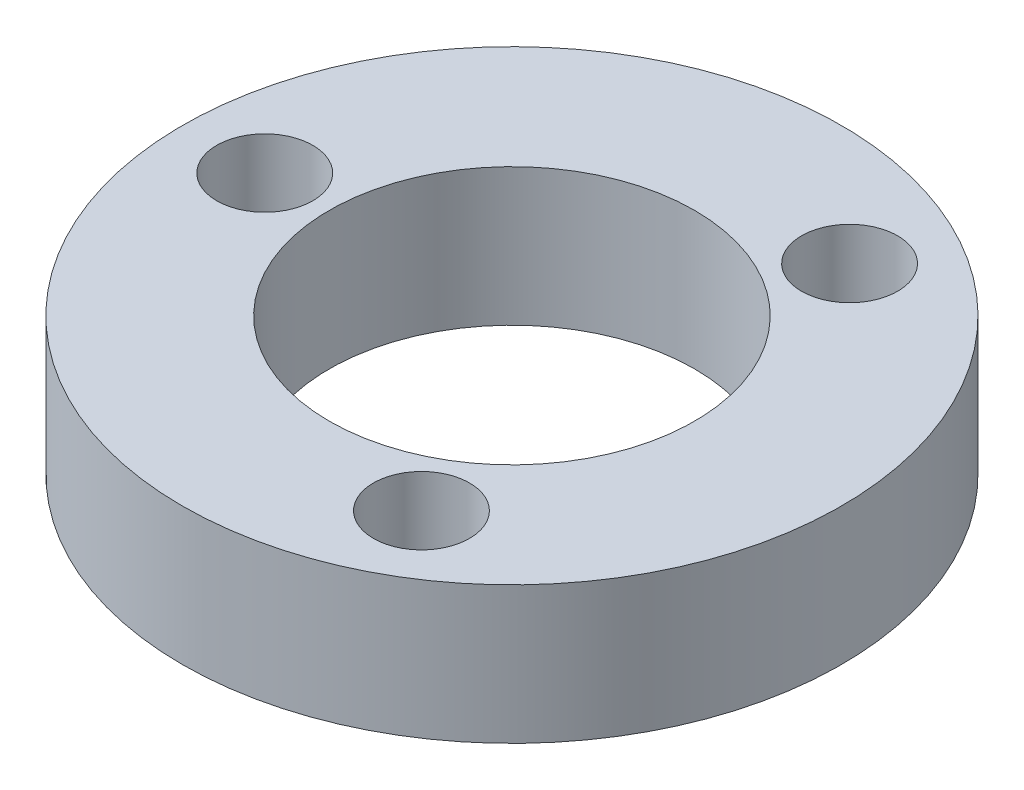
ISO-10303-21;
HEADER;
FILE_DESCRIPTION(('STEP AP214'),'2;1');
FILE_NAME('part.step','',(''),(''),'','','');
FILE_SCHEMA(('AUTOMOTIVE_DESIGN { 1 0 10303 214 1 1 1 1 }'));
ENDSEC;
DATA;
#1=APPLICATION_CONTEXT('core data for automotive mechanical design processes');
#2=APPLICATION_PROTOCOL_DEFINITION('international standard','automotive_design',2000,#1);
#3=PRODUCT_CONTEXT('',#1,'mechanical');
#4=PRODUCT('Part','Part','',(#3));
#5=PRODUCT_RELATED_PRODUCT_CATEGORY('part','',(#4));
#6=PRODUCT_DEFINITION_FORMATION('','',#4);
#7=PRODUCT_DEFINITION_CONTEXT('part definition',#1,'design');
#8=PRODUCT_DEFINITION('design','',#6,#7);
#9=PRODUCT_DEFINITION_SHAPE('','',#8);
#10=(LENGTH_UNIT() NAMED_UNIT(*) SI_UNIT(.MILLI.,.METRE.));
#11=(NAMED_UNIT(*) PLANE_ANGLE_UNIT() SI_UNIT($,.RADIAN.));
#12=(NAMED_UNIT(*) SI_UNIT($,.STERADIAN.) SOLID_ANGLE_UNIT());
#13=UNCERTAINTY_MEASURE_WITH_UNIT(LENGTH_MEASURE(1.E-05),#10,'distance_accuracy_value','');
#14=(GEOMETRIC_REPRESENTATION_CONTEXT(3) GLOBAL_UNCERTAINTY_ASSIGNED_CONTEXT((#13)) GLOBAL_UNIT_ASSIGNED_CONTEXT((#10,
#11,#12)) REPRESENTATION_CONTEXT('',''));
#15=CARTESIAN_POINT('',(0.,0.,0.));
#16=DIRECTION('',(0.,0.,1.));
#17=DIRECTION('',(1.,0.,0.));
#18=AXIS2_PLACEMENT_3D('',#15,#16,#17);
#19=CARTESIAN_POINT('',(0.,5.,0.));
#20=DIRECTION('',(0.,1.,0.));
#21=DIRECTION('',(0.,0.,1.));
#22=AXIS2_PLACEMENT_3D('',#19,#20,#21);
#23=PLANE('',#22);
#24=CARTESIAN_POINT('',(4.50000000000003,5.,-7.79422863405993));
#25=DIRECTION('',(0.,1.,0.));
#26=DIRECTION('',(0.,0.,1.));
#27=AXIS2_PLACEMENT_3D('',#24,#25,#26);
#28=CIRCLE('',#27,1.75);
#29=CARTESIAN_POINT('',(4.50000000000003,5.,-6.04422863405993));
#30=VERTEX_POINT('',#29);
#31=EDGE_CURVE('E54',#30,#30,#28,.T.);
#32=ORIENTED_EDGE('',*,*,#31,.F.);
#33=EDGE_LOOP('',(#32));
#34=FACE_BOUND('',#33,.T.);
#35=CARTESIAN_POINT('',(0.,5.,0.));
#36=DIRECTION('',(0.,1.,0.));
#37=DIRECTION('',(0.,0.,1.));
#38=AXIS2_PLACEMENT_3D('',#35,#36,#37);
#39=CIRCLE('',#38,6.65);
#40=CARTESIAN_POINT('',(0.,5.,6.65));
#41=VERTEX_POINT('',#40);
#42=EDGE_CURVE('E43',#41,#41,#39,.T.);
#43=ORIENTED_EDGE('',*,*,#42,.F.);
#44=EDGE_LOOP('',(#43));
#45=FACE_BOUND('',#44,.T.);
#46=CARTESIAN_POINT('',(0.,5.,0.));
#47=DIRECTION('',(0.,1.,0.));
#48=DIRECTION('',(0.,0.,1.));
#49=AXIS2_PLACEMENT_3D('',#46,#47,#48);
#50=CIRCLE('',#49,12.);
#51=CARTESIAN_POINT('',(0.,5.,12.));
#52=VERTEX_POINT('',#51);
#53=EDGE_CURVE('E10',#52,#52,#50,.T.);
#54=ORIENTED_EDGE('',*,*,#53,.T.);
#55=EDGE_LOOP('',(#54));
#56=FACE_BOUND('',#55,.T.);
#57=CARTESIAN_POINT('',(-9.,5.,0.));
#58=DIRECTION('',(0.,1.,0.));
#59=DIRECTION('',(0.,0.,1.));
#60=AXIS2_PLACEMENT_3D('',#57,#58,#59);
#61=CIRCLE('',#60,1.75);
#62=CARTESIAN_POINT('',(-9.,5.,1.75));
#63=VERTEX_POINT('',#62);
#64=EDGE_CURVE('E48',#63,#63,#61,.T.);
#65=ORIENTED_EDGE('',*,*,#64,.F.);
#66=EDGE_LOOP('',(#65));
#67=FACE_BOUND('',#66,.T.);
#68=CARTESIAN_POINT('',(4.49999999999993,5.,7.79422863405999));
#69=DIRECTION('',(0.,1.,0.));
#70=DIRECTION('',(0.,0.,1.));
#71=AXIS2_PLACEMENT_3D('',#68,#69,#70);
#72=CIRCLE('',#71,1.75);
#73=CARTESIAN_POINT('',(4.49999999999993,5.,9.54422863405999));
#74=VERTEX_POINT('',#73);
#75=EDGE_CURVE('E60',#74,#74,#72,.T.);
#76=ORIENTED_EDGE('',*,*,#75,.F.);
#77=EDGE_LOOP('',(#76));
#78=FACE_BOUND('',#77,.T.);
#79=ADVANCED_FACE('F32',(#34,#45,#56,#67,#78),#23,.T.);
#80=CARTESIAN_POINT('',(0.,0.,0.));
#81=DIRECTION('',(0.,1.,0.));
#82=DIRECTION('',(0.,0.,1.));
#83=AXIS2_PLACEMENT_3D('',#80,#81,#82);
#84=PLANE('',#83);
#85=CARTESIAN_POINT('',(0.,0.,0.));
#86=DIRECTION('',(0.,1.,0.));
#87=DIRECTION('',(0.,0.,1.));
#88=AXIS2_PLACEMENT_3D('',#85,#86,#87);
#89=CIRCLE('',#88,12.);
#90=CARTESIAN_POINT('',(0.,0.,12.));
#91=VERTEX_POINT('',#90);
#92=EDGE_CURVE('E36',#91,#91,#89,.T.);
#93=ORIENTED_EDGE('',*,*,#92,.F.);
#94=EDGE_LOOP('',(#93));
#95=FACE_BOUND('',#94,.T.);
#96=CARTESIAN_POINT('',(0.,0.,0.));
#97=DIRECTION('',(0.,1.,0.));
#98=DIRECTION('',(0.,0.,1.));
#99=AXIS2_PLACEMENT_3D('',#96,#97,#98);
#100=CIRCLE('',#99,6.65);
#101=CARTESIAN_POINT('',(0.,0.,6.65));
#102=VERTEX_POINT('',#101);
#103=EDGE_CURVE('E45',#102,#102,#100,.T.);
#104=ORIENTED_EDGE('',*,*,#103,.T.);
#105=EDGE_LOOP('',(#104));
#106=FACE_BOUND('',#105,.T.);
#107=CARTESIAN_POINT('',(-9.,0.,0.));
#108=DIRECTION('',(0.,1.,0.));
#109=DIRECTION('',(0.,0.,1.));
#110=AXIS2_PLACEMENT_3D('',#107,#108,#109);
#111=CIRCLE('',#110,1.75);
#112=CARTESIAN_POINT('',(-9.,0.,1.75));
#113=VERTEX_POINT('',#112);
#114=EDGE_CURVE('E51',#113,#113,#111,.T.);
#115=ORIENTED_EDGE('',*,*,#114,.T.);
#116=EDGE_LOOP('',(#115));
#117=FACE_BOUND('',#116,.T.);
#118=CARTESIAN_POINT('',(4.50000000000003,0.,-7.79422863405993));
#119=DIRECTION('',(0.,1.,0.));
#120=DIRECTION('',(0.,0.,1.));
#121=AXIS2_PLACEMENT_3D('',#118,#119,#120);
#122=CIRCLE('',#121,1.75);
#123=CARTESIAN_POINT('',(4.50000000000003,0.,-6.04422863405993));
#124=VERTEX_POINT('',#123);
#125=EDGE_CURVE('E57',#124,#124,#122,.T.);
#126=ORIENTED_EDGE('',*,*,#125,.T.);
#127=EDGE_LOOP('',(#126));
#128=FACE_BOUND('',#127,.T.);
#129=CARTESIAN_POINT('',(4.49999999999993,0.,7.79422863405999));
#130=DIRECTION('',(0.,1.,0.));
#131=DIRECTION('',(0.,0.,1.));
#132=AXIS2_PLACEMENT_3D('',#129,#130,#131);
#133=CIRCLE('',#132,1.75);
#134=CARTESIAN_POINT('',(4.49999999999993,0.,9.54422863405999));
#135=VERTEX_POINT('',#134);
#136=EDGE_CURVE('E63',#135,#135,#133,.T.);
#137=ORIENTED_EDGE('',*,*,#136,.T.);
#138=EDGE_LOOP('',(#137));
#139=FACE_BOUND('',#138,.T.);
#140=ADVANCED_FACE('F73',(#95,#106,#117,#128,#139),#84,.F.);
#141=CARTESIAN_POINT('',(0.,5.,0.));
#142=DIRECTION('',(0.,-1.,0.));
#143=DIRECTION('',(0.,0.,-1.));
#144=AXIS2_PLACEMENT_3D('',#141,#142,#143);
#145=CYLINDRICAL_SURFACE('',#144,12.);
#146=ORIENTED_EDGE('',*,*,#53,.F.);
#147=EDGE_LOOP('',(#146));
#148=FACE_BOUND('',#147,.T.);
#149=ORIENTED_EDGE('',*,*,#92,.T.);
#150=EDGE_LOOP('',(#149));
#151=FACE_BOUND('',#150,.T.);
#152=ADVANCED_FACE('F34',(#148,#151),#145,.T.);
#153=CARTESIAN_POINT('',(0.,5.,0.));
#154=DIRECTION('',(0.,-1.,0.));
#155=DIRECTION('',(0.,0.,-1.));
#156=AXIS2_PLACEMENT_3D('',#153,#154,#155);
#157=CYLINDRICAL_SURFACE('',#156,6.65);
#158=ORIENTED_EDGE('',*,*,#42,.T.);
#159=EDGE_LOOP('',(#158));
#160=FACE_BOUND('',#159,.T.);
#161=ORIENTED_EDGE('',*,*,#103,.F.);
#162=EDGE_LOOP('',(#161));
#163=FACE_BOUND('',#162,.T.);
#164=ADVANCED_FACE('F83',(#160,#163),#157,.F.);
#165=CARTESIAN_POINT('',(-9.,5.,0.));
#166=DIRECTION('',(0.,-1.,0.));
#167=DIRECTION('',(0.,0.,-1.));
#168=AXIS2_PLACEMENT_3D('',#165,#166,#167);
#169=CYLINDRICAL_SURFACE('',#168,1.75);
#170=ORIENTED_EDGE('',*,*,#64,.T.);
#171=EDGE_LOOP('',(#170));
#172=FACE_BOUND('',#171,.T.);
#173=ORIENTED_EDGE('',*,*,#114,.F.);
#174=EDGE_LOOP('',(#173));
#175=FACE_BOUND('',#174,.T.);
#176=ADVANCED_FACE('F86',(#172,#175),#169,.F.);
#177=CARTESIAN_POINT('',(4.50000000000003,5.,-7.79422863405993));
#178=DIRECTION('',(0.,-1.,0.));
#179=DIRECTION('',(0.,0.,-1.));
#180=AXIS2_PLACEMENT_3D('',#177,#178,#179);
#181=CYLINDRICAL_SURFACE('',#180,1.75);
#182=ORIENTED_EDGE('',*,*,#31,.T.);
#183=EDGE_LOOP('',(#182));
#184=FACE_BOUND('',#183,.T.);
#185=ORIENTED_EDGE('',*,*,#125,.F.);
#186=EDGE_LOOP('',(#185));
#187=FACE_BOUND('',#186,.T.);
#188=ADVANCED_FACE('F90',(#184,#187),#181,.F.);
#189=CARTESIAN_POINT('',(4.49999999999993,5.,7.79422863405999));
#190=DIRECTION('',(0.,-1.,0.));
#191=DIRECTION('',(0.,0.,-1.));
#192=AXIS2_PLACEMENT_3D('',#189,#190,#191);
#193=CYLINDRICAL_SURFACE('',#192,1.75);
#194=ORIENTED_EDGE('',*,*,#75,.T.);
#195=EDGE_LOOP('',(#194));
#196=FACE_BOUND('',#195,.T.);
#197=ORIENTED_EDGE('',*,*,#136,.F.);
#198=EDGE_LOOP('',(#197));
#199=FACE_BOUND('',#198,.T.);
#200=ADVANCED_FACE('F69',(#196,#199),#193,.F.);
#201=CLOSED_SHELL('',(#79,#140,#152,#164,#176,#188,#200));
#202=MANIFOLD_SOLID_BREP('B2',#201);
#203=ADVANCED_BREP_SHAPE_REPRESENTATION('',(#18,#202),#14);
#204=SHAPE_DEFINITION_REPRESENTATION(#9,#203);
ENDSEC;
END-ISO-10303-21;
